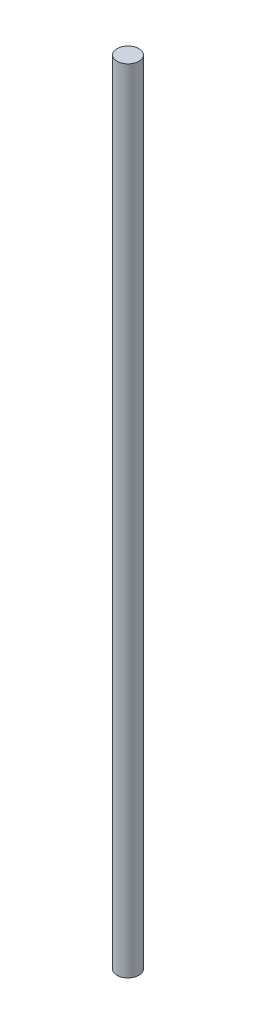
ISO-10303-21;
HEADER;
FILE_DESCRIPTION(('STEP AP214'),'2;1');
FILE_NAME('part.step','',(''),(''),'','','');
FILE_SCHEMA(('AUTOMOTIVE_DESIGN { 1 0 10303 214 1 1 1 1 }'));
ENDSEC;
DATA;
#1=APPLICATION_CONTEXT('core data for automotive mechanical design processes');
#2=APPLICATION_PROTOCOL_DEFINITION('international standard','automotive_design',2000,#1);
#3=PRODUCT_CONTEXT('',#1,'mechanical');
#4=PRODUCT('Part','Part','',(#3));
#5=PRODUCT_RELATED_PRODUCT_CATEGORY('part','',(#4));
#6=PRODUCT_DEFINITION_FORMATION('','',#4);
#7=PRODUCT_DEFINITION_CONTEXT('part definition',#1,'design');
#8=PRODUCT_DEFINITION('design','',#6,#7);
#9=PRODUCT_DEFINITION_SHAPE('','',#8);
#10=(LENGTH_UNIT() NAMED_UNIT(*) SI_UNIT(.MILLI.,.METRE.));
#11=(NAMED_UNIT(*) PLANE_ANGLE_UNIT() SI_UNIT($,.RADIAN.));
#12=(NAMED_UNIT(*) SI_UNIT($,.STERADIAN.) SOLID_ANGLE_UNIT());
#13=UNCERTAINTY_MEASURE_WITH_UNIT(LENGTH_MEASURE(1.E-05),#10,'distance_accuracy_value','');
#14=(GEOMETRIC_REPRESENTATION_CONTEXT(3) GLOBAL_UNCERTAINTY_ASSIGNED_CONTEXT((#13)) GLOBAL_UNIT_ASSIGNED_CONTEXT((#10,
#11,#12)) REPRESENTATION_CONTEXT('',''));
#15=CARTESIAN_POINT('',(0.,0.,0.));
#16=DIRECTION('',(0.,0.,1.));
#17=DIRECTION('',(1.,0.,0.));
#18=AXIS2_PLACEMENT_3D('',#15,#16,#17);
#19=CARTESIAN_POINT('',(0.,434.,0.));
#20=DIRECTION('',(0.,-1.,0.));
#21=DIRECTION('',(0.,0.,-1.));
#22=AXIS2_PLACEMENT_3D('',#19,#20,#21);
#23=CYLINDRICAL_SURFACE('',#22,6.);
#24=CARTESIAN_POINT('',(0.,434.,0.));
#25=DIRECTION('',(0.,1.,0.));
#26=DIRECTION('',(0.,0.,1.));
#27=AXIS2_PLACEMENT_3D('',#24,#25,#26);
#28=CIRCLE('',#27,6.);
#29=CARTESIAN_POINT('',(0.,434.,6.));
#30=VERTEX_POINT('',#29);
#31=EDGE_CURVE('E9',#30,#30,#28,.T.);
#32=ORIENTED_EDGE('',*,*,#31,.F.);
#33=EDGE_LOOP('',(#32));
#34=FACE_BOUND('',#33,.T.);
#35=CARTESIAN_POINT('',(0.,0.,0.));
#36=DIRECTION('',(0.,1.,0.));
#37=DIRECTION('',(0.,0.,1.));
#38=AXIS2_PLACEMENT_3D('',#35,#36,#37);
#39=CIRCLE('',#38,6.);
#40=CARTESIAN_POINT('',(0.,0.,6.));
#41=VERTEX_POINT('',#40);
#42=EDGE_CURVE('E17',#41,#41,#39,.T.);
#43=ORIENTED_EDGE('',*,*,#42,.T.);
#44=EDGE_LOOP('',(#43));
#45=FACE_BOUND('',#44,.T.);
#46=ADVANCED_FACE('F14',(#34,#45),#23,.T.);
#47=CARTESIAN_POINT('',(0.,434.,0.));
#48=DIRECTION('',(0.,1.,0.));
#49=DIRECTION('',(0.,0.,1.));
#50=AXIS2_PLACEMENT_3D('',#47,#48,#49);
#51=PLANE('',#50);
#52=ORIENTED_EDGE('',*,*,#31,.T.);
#53=EDGE_LOOP('',(#52));
#54=FACE_BOUND('',#53,.T.);
#55=ADVANCED_FACE('F29',(#54),#51,.T.);
#56=CARTESIAN_POINT('',(0.,0.,0.));
#57=DIRECTION('',(0.,1.,0.));
#58=DIRECTION('',(0.,0.,1.));
#59=AXIS2_PLACEMENT_3D('',#56,#57,#58);
#60=PLANE('',#59);
#61=ORIENTED_EDGE('',*,*,#42,.F.);
#62=EDGE_LOOP('',(#61));
#63=FACE_BOUND('',#62,.T.);
#64=ADVANCED_FACE('F27',(#63),#60,.F.);
#65=CLOSED_SHELL('',(#46,#55,#64));
#66=MANIFOLD_SOLID_BREP('B1',#65);
#67=ADVANCED_BREP_SHAPE_REPRESENTATION('',(#18,#66),#14);
#68=SHAPE_DEFINITION_REPRESENTATION(#9,#67);
ENDSEC;
END-ISO-10303-21;
